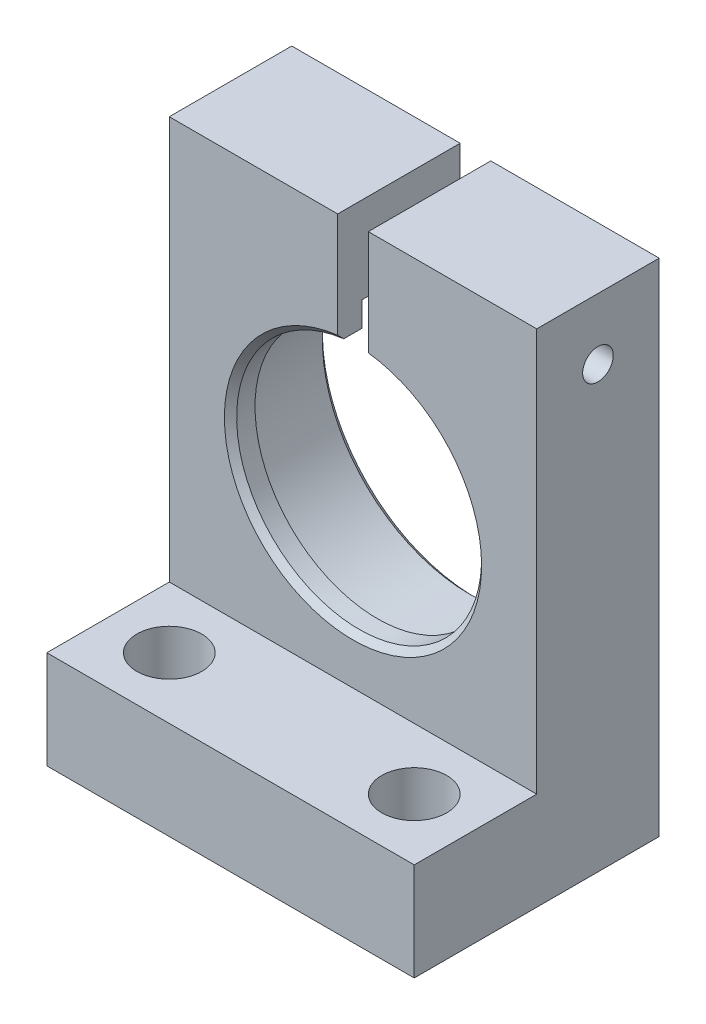
ISO-10303-21;
HEADER;
FILE_DESCRIPTION(('STEP AP214'),'2;1');
FILE_NAME('part.step','',(''),(''),'','','');
FILE_SCHEMA(('AUTOMOTIVE_DESIGN { 1 0 10303 214 1 1 1 1 }'));
ENDSEC;
DATA;
#1=APPLICATION_CONTEXT('core data for automotive mechanical design processes');
#2=APPLICATION_PROTOCOL_DEFINITION('international standard','automotive_design',2000,#1);
#3=PRODUCT_CONTEXT('',#1,'mechanical');
#4=PRODUCT('Part','Part','',(#3));
#5=PRODUCT_RELATED_PRODUCT_CATEGORY('part','',(#4));
#6=PRODUCT_DEFINITION_FORMATION('','',#4);
#7=PRODUCT_DEFINITION_CONTEXT('part definition',#1,'design');
#8=PRODUCT_DEFINITION('design','',#6,#7);
#9=PRODUCT_DEFINITION_SHAPE('','',#8);
#10=(LENGTH_UNIT() NAMED_UNIT(*) SI_UNIT(.MILLI.,.METRE.));
#11=(NAMED_UNIT(*) PLANE_ANGLE_UNIT() SI_UNIT($,.RADIAN.));
#12=(NAMED_UNIT(*) SI_UNIT($,.STERADIAN.) SOLID_ANGLE_UNIT());
#13=UNCERTAINTY_MEASURE_WITH_UNIT(LENGTH_MEASURE(1.E-05),#10,'distance_accuracy_value','');
#14=(GEOMETRIC_REPRESENTATION_CONTEXT(3) GLOBAL_UNCERTAINTY_ASSIGNED_CONTEXT((#13)) GLOBAL_UNIT_ASSIGNED_CONTEXT((#10,
#11,#12)) REPRESENTATION_CONTEXT('',''));
#15=CARTESIAN_POINT('',(0.,0.,0.));
#16=DIRECTION('',(0.,0.,1.));
#17=DIRECTION('',(1.,0.,0.));
#18=AXIS2_PLACEMENT_3D('',#15,#16,#17);
#19=CARTESIAN_POINT('',(0.,0.,10.));
#20=DIRECTION('',(0.,0.,1.));
#21=DIRECTION('',(-1.,0.,0.));
#22=AXIS2_PLACEMENT_3D('',#19,#20,#21);
#23=PLANE('',#22);
#24=DIRECTION('',(0.,-1.,0.));
#25=VECTOR('',#24,1.);
#26=CARTESIAN_POINT('',(15.,-21.9,10.));
#27=LINE('',#26,#25);
#28=CARTESIAN_POINT('',(15.,19.,10.));
#29=VERTEX_POINT('',#28);
#30=CARTESIAN_POINT('',(15.,-13.9,10.));
#31=VERTEX_POINT('',#30);
#32=EDGE_CURVE('E161',#29,#31,#27,.T.);
#33=ORIENTED_EDGE('',*,*,#32,.F.);
#34=DIRECTION('',(1.,0.,0.));
#35=VECTOR('',#34,1.);
#36=CARTESIAN_POINT('',(-15.,19.,10.));
#37=LINE('',#36,#35);
#38=CARTESIAN_POINT('',(1.25,19.,10.));
#39=VERTEX_POINT('',#38);
#40=EDGE_CURVE('E175',#39,#29,#37,.T.);
#41=ORIENTED_EDGE('',*,*,#40,.F.);
#42=DIRECTION('',(0.,-1.,0.));
#43=VECTOR('',#42,1.);
#44=CARTESIAN_POINT('',(1.25,9.92156741649221,10.));
#45=LINE('',#44,#43);
#46=CARTESIAN_POINT('',(1.25,10.4253297309965,10.));
#47=VERTEX_POINT('',#46);
#48=EDGE_CURVE('E348',#39,#47,#45,.T.);
#49=ORIENTED_EDGE('',*,*,#48,.T.);
#50=CARTESIAN_POINT('',(0.,0.,10.));
#51=DIRECTION('',(0.,0.,-1.));
#52=DIRECTION('',(-1.,0.,0.));
#53=AXIS2_PLACEMENT_3D('',#50,#51,#52);
#54=CIRCLE('',#53,10.5);
#55=CARTESIAN_POINT('',(-1.25,10.4253297309965,10.));
#56=VERTEX_POINT('',#55);
#57=EDGE_CURVE('E51',#56,#47,#54,.F.);
#58=ORIENTED_EDGE('',*,*,#57,.F.);
#59=DIRECTION('',(0.,1.,0.));
#60=VECTOR('',#59,1.);
#61=CARTESIAN_POINT('',(-1.25,9.92156741649221,10.));
#62=LINE('',#61,#60);
#63=CARTESIAN_POINT('',(-1.25,19.,10.));
#64=VERTEX_POINT('',#63);
#65=EDGE_CURVE('E343',#56,#64,#62,.T.);
#66=ORIENTED_EDGE('',*,*,#65,.T.);
#67=CARTESIAN_POINT('',(-15.,19.,10.));
#68=VERTEX_POINT('',#67);
#69=EDGE_CURVE('E184',#68,#64,#37,.T.);
#70=ORIENTED_EDGE('',*,*,#69,.F.);
#71=DIRECTION('',(0.,1.,0.));
#72=VECTOR('',#71,1.);
#73=CARTESIAN_POINT('',(-15.,-21.9,10.));
#74=LINE('',#73,#72);
#75=CARTESIAN_POINT('',(-15.,-13.9,10.));
#76=VERTEX_POINT('',#75);
#77=EDGE_CURVE('E163',#76,#68,#74,.T.);
#78=ORIENTED_EDGE('',*,*,#77,.F.);
#79=DIRECTION('',(-1.,0.,0.));
#80=VECTOR('',#79,1.);
#81=CARTESIAN_POINT('',(15.,-13.9,10.));
#82=LINE('',#81,#80);
#83=EDGE_CURVE('E148',#31,#76,#82,.T.);
#84=ORIENTED_EDGE('',*,*,#83,.F.);
#85=EDGE_LOOP('',(#33,#41,#49,#58,#66,#70,#78,#84));
#86=FACE_BOUND('',#85,.T.);
#87=ADVANCED_FACE('F41',(#86),#23,.T.);
#88=CARTESIAN_POINT('',(-15.,19.,10.));
#89=DIRECTION('',(0.,-1.,0.));
#90=DIRECTION('',(-1.,0.,0.));
#91=AXIS2_PLACEMENT_3D('',#88,#89,#90);
#92=PLANE('',#91);
#93=ORIENTED_EDGE('',*,*,#40,.T.);
#94=DIRECTION('',(0.,0.,-1.));
#95=VECTOR('',#94,1.);
#96=CARTESIAN_POINT('',(15.,19.,10.));
#97=LINE('',#96,#95);
#98=CARTESIAN_POINT('',(15.,19.,0.));
#99=VERTEX_POINT('',#98);
#100=EDGE_CURVE('E168',#29,#99,#97,.T.);
#101=ORIENTED_EDGE('',*,*,#100,.T.);
#102=DIRECTION('',(1.,0.,0.));
#103=VECTOR('',#102,1.);
#104=CARTESIAN_POINT('',(-15.,19.,0.));
#105=LINE('',#104,#103);
#106=CARTESIAN_POINT('',(1.25,19.,0.));
#107=VERTEX_POINT('',#106);
#108=EDGE_CURVE('E178',#107,#99,#105,.T.);
#109=ORIENTED_EDGE('',*,*,#108,.F.);
#110=DIRECTION('',(0.,0.,1.));
#111=VECTOR('',#110,1.);
#112=CARTESIAN_POINT('',(1.25,19.,0.));
#113=LINE('',#112,#111);
#114=EDGE_CURVE('E334',#107,#39,#113,.T.);
#115=ORIENTED_EDGE('',*,*,#114,.T.);
#116=EDGE_LOOP('',(#93,#101,#109,#115));
#117=FACE_BOUND('',#116,.T.);
#118=ADVANCED_FACE('F293',(#117),#92,.F.);
#119=CARTESIAN_POINT('',(0.,0.,0.));
#120=DIRECTION('',(0.,0.,1.));
#121=DIRECTION('',(-1.,0.,0.));
#122=AXIS2_PLACEMENT_3D('',#119,#120,#121);
#123=PLANE('',#122);
#124=DIRECTION('',(0.,-1.,0.));
#125=VECTOR('',#124,1.);
#126=CARTESIAN_POINT('',(1.25,9.92156741649221,0.));
#127=LINE('',#126,#125);
#128=CARTESIAN_POINT('',(1.25,12.4373429638328,0.));
#129=VERTEX_POINT('',#128);
#130=EDGE_CURVE('E347',#107,#129,#127,.T.);
#131=ORIENTED_EDGE('',*,*,#130,.F.);
#132=ORIENTED_EDGE('',*,*,#108,.T.);
#133=DIRECTION('',(0.,-1.,0.));
#134=VECTOR('',#133,1.);
#135=CARTESIAN_POINT('',(15.,-21.9,0.));
#136=LINE('',#135,#134);
#137=CARTESIAN_POINT('',(15.,-21.9,0.));
#138=VERTEX_POINT('',#137);
#139=EDGE_CURVE('E188',#99,#138,#136,.T.);
#140=ORIENTED_EDGE('',*,*,#139,.T.);
#141=DIRECTION('',(-1.,0.,0.));
#142=VECTOR('',#141,1.);
#143=CARTESIAN_POINT('',(-15.,-21.9,0.));
#144=LINE('',#143,#142);
#145=CARTESIAN_POINT('',(-15.,-21.9,0.));
#146=VERTEX_POINT('',#145);
#147=EDGE_CURVE('E192',#138,#146,#144,.T.);
#148=ORIENTED_EDGE('',*,*,#147,.T.);
#149=DIRECTION('',(0.,1.,0.));
#150=VECTOR('',#149,1.);
#151=CARTESIAN_POINT('',(-15.,-21.9,0.));
#152=LINE('',#151,#150);
#153=CARTESIAN_POINT('',(-15.,19.,0.));
#154=VERTEX_POINT('',#153);
#155=EDGE_CURVE('E196',#146,#154,#152,.T.);
#156=ORIENTED_EDGE('',*,*,#155,.T.);
#157=CARTESIAN_POINT('',(-1.25,19.,0.));
#158=VERTEX_POINT('',#157);
#159=EDGE_CURVE('E171',#154,#158,#105,.T.);
#160=ORIENTED_EDGE('',*,*,#159,.T.);
#161=DIRECTION('',(0.,1.,0.));
#162=VECTOR('',#161,1.);
#163=CARTESIAN_POINT('',(-1.25,9.92156741649221,0.));
#164=LINE('',#163,#162);
#165=CARTESIAN_POINT('',(-1.25,12.4373429638328,0.));
#166=VERTEX_POINT('',#165);
#167=EDGE_CURVE('E340',#166,#158,#164,.T.);
#168=ORIENTED_EDGE('',*,*,#167,.F.);
#169=CARTESIAN_POINT('',(0.,0.,0.));
#170=DIRECTION('',(0.,0.,-1.));
#171=DIRECTION('',(-1.,0.,0.));
#172=AXIS2_PLACEMENT_3D('',#169,#170,#171);
#173=CIRCLE('',#172,12.5);
#174=EDGE_CURVE('E222',#129,#166,#173,.T.);
#175=ORIENTED_EDGE('',*,*,#174,.F.);
#176=EDGE_LOOP('',(#131,#132,#140,#148,#156,#160,#168,#175));
#177=FACE_BOUND('',#176,.T.);
#178=ADVANCED_FACE('F279',(#177),#123,.F.);
#179=CARTESIAN_POINT('',(15.,-21.9,10.));
#180=DIRECTION('',(-1.,0.,0.));
#181=DIRECTION('',(0.,0.,-1.));
#182=AXIS2_PLACEMENT_3D('',#179,#180,#181);
#183=PLANE('',#182);
#184=CARTESIAN_POINT('',(15.,14.,5.));
#185=DIRECTION('',(-1.,0.,0.));
#186=DIRECTION('',(0.,0.,1.));
#187=AXIS2_PLACEMENT_3D('',#184,#185,#186);
#188=CIRCLE('',#187,1.25);
#189=CARTESIAN_POINT('',(15.,14.,6.25));
#190=VERTEX_POINT('',#189);
#191=EDGE_CURVE('E377',#190,#190,#188,.T.);
#192=ORIENTED_EDGE('',*,*,#191,.T.);
#193=EDGE_LOOP('',(#192));
#194=FACE_BOUND('',#193,.T.);
#195=ORIENTED_EDGE('',*,*,#139,.F.);
#196=ORIENTED_EDGE('',*,*,#100,.F.);
#197=ORIENTED_EDGE('',*,*,#32,.T.);
#198=DIRECTION('',(0.,0.,-1.));
#199=VECTOR('',#198,1.);
#200=CARTESIAN_POINT('',(15.,-13.9,10.));
#201=LINE('',#200,#199);
#202=CARTESIAN_POINT('',(15.,-13.9,20.));
#203=VERTEX_POINT('',#202);
#204=EDGE_CURVE('E145',#203,#31,#201,.T.);
#205=ORIENTED_EDGE('',*,*,#204,.F.);
#206=DIRECTION('',(0.,-1.,0.));
#207=VECTOR('',#206,1.);
#208=CARTESIAN_POINT('',(15.,-13.9,20.));
#209=LINE('',#208,#207);
#210=CARTESIAN_POINT('',(15.,-21.9,20.));
#211=VERTEX_POINT('',#210);
#212=EDGE_CURVE('E381',#203,#211,#209,.T.);
#213=ORIENTED_EDGE('',*,*,#212,.T.);
#214=DIRECTION('',(0.,0.,-1.));
#215=VECTOR('',#214,1.);
#216=CARTESIAN_POINT('',(15.,-21.9,10.));
#217=LINE('',#216,#215);
#218=EDGE_CURVE('E208',#211,#138,#217,.T.);
#219=ORIENTED_EDGE('',*,*,#218,.T.);
#220=EDGE_LOOP('',(#195,#196,#197,#205,#213,#219));
#221=FACE_BOUND('',#220,.T.);
#222=ADVANCED_FACE('F166',(#194,#221),#183,.F.);
#223=CARTESIAN_POINT('',(-15.,-21.9,10.));
#224=DIRECTION('',(0.,1.,0.));
#225=DIRECTION('',(1.,0.,0.));
#226=AXIS2_PLACEMENT_3D('',#223,#224,#225);
#227=PLANE('',#226);
#228=CARTESIAN_POINT('',(10.,-21.9,15.));
#229=DIRECTION('',(0.,-1.,0.));
#230=DIRECTION('',(1.,0.,0.));
#231=AXIS2_PLACEMENT_3D('',#228,#229,#230);
#232=CIRCLE('',#231,2.65);
#233=CARTESIAN_POINT('',(12.65,-21.9,15.));
#234=VERTEX_POINT('',#233);
#235=EDGE_CURVE('E401',#234,#234,#232,.T.);
#236=ORIENTED_EDGE('',*,*,#235,.F.);
#237=EDGE_LOOP('',(#236));
#238=FACE_BOUND('',#237,.T.);
#239=CARTESIAN_POINT('',(-10.,-21.9,15.));
#240=DIRECTION('',(0.,-1.,0.));
#241=DIRECTION('',(1.,0.,0.));
#242=AXIS2_PLACEMENT_3D('',#239,#240,#241);
#243=CIRCLE('',#242,2.65);
#244=CARTESIAN_POINT('',(-7.35,-21.9,15.));
#245=VERTEX_POINT('',#244);
#246=EDGE_CURVE('E389',#245,#245,#243,.T.);
#247=ORIENTED_EDGE('',*,*,#246,.F.);
#248=EDGE_LOOP('',(#247));
#249=FACE_BOUND('',#248,.T.);
#250=ORIENTED_EDGE('',*,*,#147,.F.);
#251=ORIENTED_EDGE('',*,*,#218,.F.);
#252=DIRECTION('',(1.,0.,0.));
#253=VECTOR('',#252,1.);
#254=CARTESIAN_POINT('',(15.,-21.9,20.));
#255=LINE('',#254,#253);
#256=CARTESIAN_POINT('',(-15.,-21.9,20.));
#257=VERTEX_POINT('',#256);
#258=EDGE_CURVE('E156',#257,#211,#255,.T.);
#259=ORIENTED_EDGE('',*,*,#258,.F.);
#260=DIRECTION('',(0.,0.,-1.));
#261=VECTOR('',#260,1.);
#262=CARTESIAN_POINT('',(-15.,-21.9,10.));
#263=LINE('',#262,#261);
#264=EDGE_CURVE('E205',#257,#146,#263,.T.);
#265=ORIENTED_EDGE('',*,*,#264,.T.);
#266=EDGE_LOOP('',(#250,#251,#259,#265));
#267=FACE_BOUND('',#266,.T.);
#268=ADVANCED_FACE('F278',(#238,#249,#267),#227,.F.);
#269=CARTESIAN_POINT('',(-15.,-21.9,10.));
#270=DIRECTION('',(1.,0.,0.));
#271=DIRECTION('',(0.,0.,1.));
#272=AXIS2_PLACEMENT_3D('',#269,#270,#271);
#273=PLANE('',#272);
#274=CARTESIAN_POINT('',(-15.,14.,5.));
#275=DIRECTION('',(1.,0.,0.));
#276=DIRECTION('',(0.,0.,-1.));
#277=AXIS2_PLACEMENT_3D('',#274,#275,#276);
#278=CIRCLE('',#277,3.25);
#279=CARTESIAN_POINT('',(-15.,14.,1.75));
#280=VERTEX_POINT('',#279);
#281=EDGE_CURVE('E369',#280,#280,#278,.T.);
#282=ORIENTED_EDGE('',*,*,#281,.T.);
#283=EDGE_LOOP('',(#282));
#284=FACE_BOUND('',#283,.T.);
#285=ORIENTED_EDGE('',*,*,#155,.F.);
#286=ORIENTED_EDGE('',*,*,#264,.F.);
#287=DIRECTION('',(0.,-1.,0.));
#288=VECTOR('',#287,1.);
#289=CARTESIAN_POINT('',(-15.,-13.9,20.));
#290=LINE('',#289,#288);
#291=CARTESIAN_POINT('',(-15.,-13.9,20.));
#292=VERTEX_POINT('',#291);
#293=EDGE_CURVE('E382',#292,#257,#290,.T.);
#294=ORIENTED_EDGE('',*,*,#293,.F.);
#295=DIRECTION('',(0.,0.,1.));
#296=VECTOR('',#295,1.);
#297=CARTESIAN_POINT('',(-15.,-13.9,10.));
#298=LINE('',#297,#296);
#299=EDGE_CURVE('E58',#76,#292,#298,.T.);
#300=ORIENTED_EDGE('',*,*,#299,.F.);
#301=ORIENTED_EDGE('',*,*,#77,.T.);
#302=DIRECTION('',(0.,0.,-1.));
#303=VECTOR('',#302,1.);
#304=CARTESIAN_POINT('',(-15.,19.,10.));
#305=LINE('',#304,#303);
#306=EDGE_CURVE('E202',#68,#154,#305,.T.);
#307=ORIENTED_EDGE('',*,*,#306,.T.);
#308=EDGE_LOOP('',(#285,#286,#294,#300,#301,#307));
#309=FACE_BOUND('',#308,.T.);
#310=ADVANCED_FACE('F283',(#284,#309),#273,.F.);
#311=ORIENTED_EDGE('',*,*,#159,.F.);
#312=ORIENTED_EDGE('',*,*,#306,.F.);
#313=ORIENTED_EDGE('',*,*,#69,.T.);
#314=DIRECTION('',(0.,0.,1.));
#315=VECTOR('',#314,1.);
#316=CARTESIAN_POINT('',(-1.25,19.,0.));
#317=LINE('',#316,#315);
#318=EDGE_CURVE('E337',#158,#64,#317,.T.);
#319=ORIENTED_EDGE('',*,*,#318,.F.);
#320=EDGE_LOOP('',(#311,#312,#313,#319));
#321=FACE_BOUND('',#320,.T.);
#322=ADVANCED_FACE('F287',(#321),#92,.F.);
#323=CARTESIAN_POINT('',(0.,0.,10.));
#324=DIRECTION('',(0.,0.,-1.));
#325=DIRECTION('',(1.,0.,0.));
#326=AXIS2_PLACEMENT_3D('',#323,#324,#325);
#327=CYLINDRICAL_SURFACE('',#326,12.);
#328=DIRECTION('',(0.,0.,-1.));
#329=VECTOR('',#328,1.);
#330=CARTESIAN_POINT('',(-1.25,11.93471826228,10.));
#331=LINE('',#330,#329);
#332=CARTESIAN_POINT('',(-1.25,11.93471826228,0.500000000000002));
#333=VERTEX_POINT('',#332);
#334=CARTESIAN_POINT('',(-1.25,11.93471826228,8.));
#335=VERTEX_POINT('',#334);
#336=EDGE_CURVE('E320',#333,#335,#331,.F.);
#337=ORIENTED_EDGE('',*,*,#336,.T.);
#338=CARTESIAN_POINT('',(0.,0.,8.));
#339=DIRECTION('',(0.,0.,1.));
#340=DIRECTION('',(1.,0.,0.));
#341=AXIS2_PLACEMENT_3D('',#338,#339,#340);
#342=CIRCLE('',#341,12.);
#343=CARTESIAN_POINT('',(1.25,11.93471826228,8.));
#344=VERTEX_POINT('',#343);
#345=EDGE_CURVE('E211',#335,#344,#342,.T.);
#346=ORIENTED_EDGE('',*,*,#345,.T.);
#347=DIRECTION('',(0.,0.,-1.));
#348=VECTOR('',#347,1.);
#349=CARTESIAN_POINT('',(1.25,11.93471826228,10.));
#350=LINE('',#349,#348);
#351=CARTESIAN_POINT('',(1.25,11.93471826228,0.500000000000002));
#352=VERTEX_POINT('',#351);
#353=EDGE_CURVE('E319',#344,#352,#350,.T.);
#354=ORIENTED_EDGE('',*,*,#353,.T.);
#355=CARTESIAN_POINT('',(0.,0.,0.500000000000002));
#356=DIRECTION('',(0.,0.,-1.));
#357=DIRECTION('',(-1.,0.,0.));
#358=AXIS2_PLACEMENT_3D('',#355,#356,#357);
#359=CIRCLE('',#358,12.);
#360=EDGE_CURVE('E328',#333,#352,#359,.F.);
#361=ORIENTED_EDGE('',*,*,#360,.F.);
#362=EDGE_LOOP('',(#337,#346,#354,#361));
#363=FACE_BOUND('',#362,.T.);
#364=ADVANCED_FACE('F291',(#363),#327,.F.);
#365=CARTESIAN_POINT('',(0.,0.,8.));
#366=DIRECTION('',(0.,0.,-1.));
#367=DIRECTION('',(1.,0.,0.));
#368=AXIS2_PLACEMENT_3D('',#365,#366,#367);
#369=PLANE('',#368);
#370=DIRECTION('',(0.,1.,0.));
#371=VECTOR('',#370,1.);
#372=CARTESIAN_POINT('',(1.25,0.,8.));
#373=LINE('',#372,#371);
#374=CARTESIAN_POINT('',(1.25,9.92156741649221,8.));
#375=VERTEX_POINT('',#374);
#376=EDGE_CURVE('E311',#375,#344,#373,.T.);
#377=ORIENTED_EDGE('',*,*,#376,.T.);
#378=ORIENTED_EDGE('',*,*,#345,.F.);
#379=DIRECTION('',(0.,-1.,0.));
#380=VECTOR('',#379,1.);
#381=CARTESIAN_POINT('',(-1.25,0.,8.));
#382=LINE('',#381,#380);
#383=CARTESIAN_POINT('',(-1.25,9.92156741649221,8.));
#384=VERTEX_POINT('',#383);
#385=EDGE_CURVE('E331',#335,#384,#382,.T.);
#386=ORIENTED_EDGE('',*,*,#385,.T.);
#387=CARTESIAN_POINT('',(0.,0.,8.));
#388=DIRECTION('',(0.,0.,1.));
#389=DIRECTION('',(1.,0.,0.));
#390=AXIS2_PLACEMENT_3D('',#387,#388,#389);
#391=CIRCLE('',#390,10.);
#392=EDGE_CURVE('E181',#384,#375,#391,.T.);
#393=ORIENTED_EDGE('',*,*,#392,.T.);
#394=EDGE_LOOP('',(#377,#378,#386,#393));
#395=FACE_BOUND('',#394,.T.);
#396=ADVANCED_FACE('F300',(#395),#369,.T.);
#397=CARTESIAN_POINT('',(0.,0.,8.));
#398=DIRECTION('',(0.,0.,1.));
#399=DIRECTION('',(-1.,0.,0.));
#400=AXIS2_PLACEMENT_3D('',#397,#398,#399);
#401=CYLINDRICAL_SURFACE('',#400,10.);
#402=DIRECTION('',(0.,0.,1.));
#403=VECTOR('',#402,1.);
#404=CARTESIAN_POINT('',(1.25,9.92156741649221,8.));
#405=LINE('',#404,#403);
#406=CARTESIAN_POINT('',(1.25,9.92156741649221,9.50000000000001));
#407=VERTEX_POINT('',#406);
#408=EDGE_CURVE('E215',#407,#375,#405,.F.);
#409=ORIENTED_EDGE('',*,*,#408,.T.);
#410=ORIENTED_EDGE('',*,*,#392,.F.);
#411=DIRECTION('',(0.,0.,1.));
#412=VECTOR('',#411,1.);
#413=CARTESIAN_POINT('',(-1.25,9.92156741649221,8.));
#414=LINE('',#413,#412);
#415=CARTESIAN_POINT('',(-1.25,9.92156741649221,9.50000000000001));
#416=VERTEX_POINT('',#415);
#417=EDGE_CURVE('E218',#384,#416,#414,.T.);
#418=ORIENTED_EDGE('',*,*,#417,.T.);
#419=CARTESIAN_POINT('',(0.,0.,9.50000000000001));
#420=DIRECTION('',(0.,0.,-1.));
#421=DIRECTION('',(-1.,0.,0.));
#422=AXIS2_PLACEMENT_3D('',#419,#420,#421);
#423=CIRCLE('',#422,10.);
#424=EDGE_CURVE('E11',#407,#416,#423,.T.);
#425=ORIENTED_EDGE('',*,*,#424,.F.);
#426=EDGE_LOOP('',(#409,#410,#418,#425));
#427=FACE_BOUND('',#426,.T.);
#428=ADVANCED_FACE('F253',(#427),#401,.F.);
#429=CARTESIAN_POINT('',(1.25,9.92156741649221,0.));
#430=DIRECTION('',(1.,0.,0.));
#431=DIRECTION('',(0.,-1.,0.));
#432=AXIS2_PLACEMENT_3D('',#429,#430,#431);
#433=PLANE('',#432);
#434=CARTESIAN_POINT('',(1.25,14.,5.));
#435=DIRECTION('',(-1.,0.,0.));
#436=DIRECTION('',(0.,-1.,0.));
#437=AXIS2_PLACEMENT_3D('',#434,#435,#436);
#438=CIRCLE('',#437,1.25);
#439=CARTESIAN_POINT('',(1.25,12.75,5.));
#440=VERTEX_POINT('',#439);
#441=EDGE_CURVE('E373',#440,#440,#438,.T.);
#442=ORIENTED_EDGE('',*,*,#441,.F.);
#443=EDGE_LOOP('',(#442));
#444=FACE_BOUND('',#443,.T.);
#445=ORIENTED_EDGE('',*,*,#353,.F.);
#446=ORIENTED_EDGE('',*,*,#376,.F.);
#447=ORIENTED_EDGE('',*,*,#408,.F.);
#448=CARTESIAN_POINT('',(1.25,10.4253297309965,10.));
#449=CARTESIAN_POINT('',(1.25,10.3413846963342,9.91665120010179));
#450=CARTESIAN_POINT('',(1.25,10.2574319861363,9.83331013349464));
#451=CARTESIAN_POINT('',(1.25,10.0895112146349,9.66664346682797));
#452=CARTESIAN_POINT('',(1.25,10.0055431533313,9.58331786676846));
#453=CARTESIAN_POINT('',(1.25,9.92156741649221,9.50000000000001));
#454=B_SPLINE_CURVE_WITH_KNOTS('',3,(#448,#449,#450,#451,#452,#453),.UNSPECIFIED.,.F.,.F.,(4,2,
4),(0.,0.354886063962817,0.709772128072496),.UNSPECIFIED.);
#455=EDGE_CURVE('E65',#47,#407,#454,.T.);
#456=ORIENTED_EDGE('',*,*,#455,.F.);
#457=ORIENTED_EDGE('',*,*,#48,.F.);
#458=ORIENTED_EDGE('',*,*,#114,.F.);
#459=ORIENTED_EDGE('',*,*,#130,.T.);
#460=CARTESIAN_POINT('',(1.25,11.93471826228,0.500000000000002));
#461=CARTESIAN_POINT('',(1.25,12.0184979967429,0.416675664514309));
#462=CARTESIAN_POINT('',(1.25,12.1022732557729,0.333346830102343));
#463=CARTESIAN_POINT('',(1.25,12.2698148229571,0.166680163435674));
#464=CARTESIAN_POINT('',(1.25,12.3535811311114,0.083342331180973));
#465=CARTESIAN_POINT('',(1.25,12.4373429638328,0.));
#466=B_SPLINE_CURVE_WITH_KNOTS('',3,(#460,#461,#462,#463,#464,#465),.UNSPECIFIED.,.F.,.F.,(4,2,
4),(0.,0.354482577893423,0.708965155745116),.UNSPECIFIED.);
#467=EDGE_CURVE('E263',#352,#129,#466,.T.);
#468=ORIENTED_EDGE('',*,*,#467,.F.);
#469=EDGE_LOOP('',(#445,#446,#447,#456,#457,#458,#459,#468));
#470=FACE_BOUND('',#469,.T.);
#471=ADVANCED_FACE('F246',(#444,#470),#433,.F.);
#472=CARTESIAN_POINT('',(-1.25,9.92156741649221,0.));
#473=DIRECTION('',(-1.,0.,0.));
#474=DIRECTION('',(0.,1.,0.));
#475=AXIS2_PLACEMENT_3D('',#472,#473,#474);
#476=PLANE('',#475);
#477=CARTESIAN_POINT('',(-1.25,14.,5.));
#478=DIRECTION('',(1.,0.,0.));
#479=DIRECTION('',(0.,1.,0.));
#480=AXIS2_PLACEMENT_3D('',#477,#478,#479);
#481=CIRCLE('',#480,1.6);
#482=CARTESIAN_POINT('',(-1.25,15.6,5.));
#483=VERTEX_POINT('',#482);
#484=EDGE_CURVE('E352',#483,#483,#481,.T.);
#485=ORIENTED_EDGE('',*,*,#484,.F.);
#486=EDGE_LOOP('',(#485));
#487=FACE_BOUND('',#486,.T.);
#488=ORIENTED_EDGE('',*,*,#167,.T.);
#489=ORIENTED_EDGE('',*,*,#318,.T.);
#490=ORIENTED_EDGE('',*,*,#65,.F.);
#491=CARTESIAN_POINT('',(-1.25,9.92156741649221,9.50000000000001));
#492=CARTESIAN_POINT('',(-1.25,10.0055431533313,9.58331786676846));
#493=CARTESIAN_POINT('',(-1.25,10.0895112146349,9.66664346682797));
#494=CARTESIAN_POINT('',(-1.25,10.2574319861363,9.83331013349464));
#495=CARTESIAN_POINT('',(-1.25,10.3413846963342,9.91665120010179));
#496=CARTESIAN_POINT('',(-1.25,10.4253297309965,10.));
#497=B_SPLINE_CURVE_WITH_KNOTS('',3,(#491,#492,#493,#494,#495,#496),.UNSPECIFIED.,.F.,.F.,(4,2,
4),(0.,0.35488606410968,0.709772128072496),.UNSPECIFIED.);
#498=EDGE_CURVE('E226',#416,#56,#497,.T.);
#499=ORIENTED_EDGE('',*,*,#498,.F.);
#500=ORIENTED_EDGE('',*,*,#417,.F.);
#501=ORIENTED_EDGE('',*,*,#385,.F.);
#502=ORIENTED_EDGE('',*,*,#336,.F.);
#503=CARTESIAN_POINT('',(-1.25,12.4373429638328,0.));
#504=CARTESIAN_POINT('',(-1.25,12.3535811311114,0.0833423311809731));
#505=CARTESIAN_POINT('',(-1.25,12.2698148229571,0.166680163435674));
#506=CARTESIAN_POINT('',(-1.25,12.1022732557729,0.333346830102342));
#507=CARTESIAN_POINT('',(-1.25,12.0184979967429,0.416675664514308));
#508=CARTESIAN_POINT('',(-1.25,11.93471826228,0.500000000000001));
#509=B_SPLINE_CURVE_WITH_KNOTS('',3,(#503,#504,#505,#506,#507,#508),.UNSPECIFIED.,.F.,.F.,(4,2,
4),(0.,0.354482577851693,0.708965155745116),.UNSPECIFIED.);
#510=EDGE_CURVE('E234',#166,#333,#509,.T.);
#511=ORIENTED_EDGE('',*,*,#510,.F.);
#512=EDGE_LOOP('',(#488,#489,#490,#499,#500,#501,#502,#511));
#513=FACE_BOUND('',#512,.T.);
#514=ADVANCED_FACE('F240',(#487,#513),#476,.F.);
#515=CARTESIAN_POINT('',(-15.,14.,5.));
#516=DIRECTION('',(-1.,0.,0.));
#517=DIRECTION('',(0.,0.,-1.));
#518=AXIS2_PLACEMENT_3D('',#515,#516,#517);
#519=CYLINDRICAL_SURFACE('',#518,1.6);
#520=ORIENTED_EDGE('',*,*,#484,.T.);
#521=EDGE_LOOP('',(#520));
#522=FACE_BOUND('',#521,.T.);
#523=CARTESIAN_POINT('',(-12.,14.,5.));
#524=DIRECTION('',(1.,0.,0.));
#525=DIRECTION('',(0.,0.,-1.));
#526=AXIS2_PLACEMENT_3D('',#523,#524,#525);
#527=CIRCLE('',#526,1.6);
#528=CARTESIAN_POINT('',(-12.,14.,3.4));
#529=VERTEX_POINT('',#528);
#530=EDGE_CURVE('E361',#529,#529,#527,.T.);
#531=ORIENTED_EDGE('',*,*,#530,.F.);
#532=EDGE_LOOP('',(#531));
#533=FACE_BOUND('',#532,.T.);
#534=ADVANCED_FACE('F245',(#522,#533),#519,.F.);
#535=CARTESIAN_POINT('',(-12.,15.6,5.));
#536=DIRECTION('',(1.,0.,0.));
#537=DIRECTION('',(0.,0.,1.));
#538=AXIS2_PLACEMENT_3D('',#535,#536,#537);
#539=PLANE('',#538);
#540=ORIENTED_EDGE('',*,*,#530,.T.);
#541=EDGE_LOOP('',(#540));
#542=FACE_BOUND('',#541,.T.);
#543=CARTESIAN_POINT('',(-12.,14.,5.));
#544=DIRECTION('',(1.,0.,0.));
#545=DIRECTION('',(0.,0.,-1.));
#546=AXIS2_PLACEMENT_3D('',#543,#544,#545);
#547=CIRCLE('',#546,3.25);
#548=CARTESIAN_POINT('',(-12.,14.,1.75));
#549=VERTEX_POINT('',#548);
#550=EDGE_CURVE('E365',#549,#549,#547,.T.);
#551=ORIENTED_EDGE('',*,*,#550,.F.);
#552=EDGE_LOOP('',(#551));
#553=FACE_BOUND('',#552,.T.);
#554=ADVANCED_FACE('F434',(#542,#553),#539,.F.);
#555=CARTESIAN_POINT('',(-15.,14.,5.));
#556=DIRECTION('',(-1.,0.,0.));
#557=DIRECTION('',(0.,0.,-1.));
#558=AXIS2_PLACEMENT_3D('',#555,#556,#557);
#559=CYLINDRICAL_SURFACE('',#558,3.25);
#560=ORIENTED_EDGE('',*,*,#550,.T.);
#561=EDGE_LOOP('',(#560));
#562=FACE_BOUND('',#561,.T.);
#563=ORIENTED_EDGE('',*,*,#281,.F.);
#564=EDGE_LOOP('',(#563));
#565=FACE_BOUND('',#564,.T.);
#566=ADVANCED_FACE('F431',(#562,#565),#559,.F.);
#567=CARTESIAN_POINT('',(15.,14.,5.));
#568=DIRECTION('',(1.,0.,0.));
#569=DIRECTION('',(0.,0.,1.));
#570=AXIS2_PLACEMENT_3D('',#567,#568,#569);
#571=CYLINDRICAL_SURFACE('',#570,1.25);
#572=ORIENTED_EDGE('',*,*,#441,.T.);
#573=EDGE_LOOP('',(#572));
#574=FACE_BOUND('',#573,.T.);
#575=ORIENTED_EDGE('',*,*,#191,.F.);
#576=EDGE_LOOP('',(#575));
#577=FACE_BOUND('',#576,.T.);
#578=ADVANCED_FACE('F273',(#574,#577),#571,.F.);
#579=CARTESIAN_POINT('',(0.,0.,0.));
#580=DIRECTION('',(0.,0.,-1.));
#581=DIRECTION('',(1.,0.,0.));
#582=AXIS2_PLACEMENT_3D('',#579,#580,#581);
#583=CONICAL_SURFACE('',#582,12.5,0.785398163397448);
#584=ORIENTED_EDGE('',*,*,#467,.T.);
#585=ORIENTED_EDGE('',*,*,#174,.T.);
#586=ORIENTED_EDGE('',*,*,#510,.T.);
#587=ORIENTED_EDGE('',*,*,#360,.T.);
#588=EDGE_LOOP('',(#584,#585,#586,#587));
#589=FACE_BOUND('',#588,.T.);
#590=ADVANCED_FACE('F269',(#589),#583,.F.);
#591=CARTESIAN_POINT('',(0.,0.,10.));
#592=DIRECTION('',(0.,0.,1.));
#593=DIRECTION('',(-1.,0.,0.));
#594=AXIS2_PLACEMENT_3D('',#591,#592,#593);
#595=CONICAL_SURFACE('',#594,10.5,0.785398163397448);
#596=ORIENTED_EDGE('',*,*,#498,.T.);
#597=ORIENTED_EDGE('',*,*,#57,.T.);
#598=ORIENTED_EDGE('',*,*,#455,.T.);
#599=ORIENTED_EDGE('',*,*,#424,.T.);
#600=EDGE_LOOP('',(#596,#597,#598,#599));
#601=FACE_BOUND('',#600,.T.);
#602=ADVANCED_FACE('F43',(#601),#595,.F.);
#603=CARTESIAN_POINT('',(15.,-13.9,20.));
#604=DIRECTION('',(0.,0.,1.));
#605=DIRECTION('',(-1.,0.,0.));
#606=AXIS2_PLACEMENT_3D('',#603,#604,#605);
#607=PLANE('',#606);
#608=ORIENTED_EDGE('',*,*,#258,.T.);
#609=ORIENTED_EDGE('',*,*,#212,.F.);
#610=DIRECTION('',(1.,0.,0.));
#611=VECTOR('',#610,1.);
#612=CARTESIAN_POINT('',(15.,-13.9,20.));
#613=LINE('',#612,#611);
#614=EDGE_CURVE('E150',#292,#203,#613,.T.);
#615=ORIENTED_EDGE('',*,*,#614,.F.);
#616=ORIENTED_EDGE('',*,*,#293,.T.);
#617=EDGE_LOOP('',(#608,#609,#615,#616));
#618=FACE_BOUND('',#617,.T.);
#619=ADVANCED_FACE('F425',(#618),#607,.T.);
#620=CARTESIAN_POINT('',(0.,-13.9,0.));
#621=DIRECTION('',(0.,1.,0.));
#622=DIRECTION('',(1.,0.,0.));
#623=AXIS2_PLACEMENT_3D('',#620,#621,#622);
#624=PLANE('',#623);
#625=CARTESIAN_POINT('',(10.,-13.9,15.));
#626=DIRECTION('',(0.,-1.,0.));
#627=DIRECTION('',(0.,0.,1.));
#628=AXIS2_PLACEMENT_3D('',#625,#626,#627);
#629=CIRCLE('',#628,2.65);
#630=CARTESIAN_POINT('',(10.,-13.9,17.65));
#631=VERTEX_POINT('',#630);
#632=EDGE_CURVE('E405',#631,#631,#629,.T.);
#633=ORIENTED_EDGE('',*,*,#632,.T.);
#634=EDGE_LOOP('',(#633));
#635=FACE_BOUND('',#634,.T.);
#636=CARTESIAN_POINT('',(-10.,-13.9,15.));
#637=DIRECTION('',(0.,-1.,0.));
#638=DIRECTION('',(0.,0.,1.));
#639=AXIS2_PLACEMENT_3D('',#636,#637,#638);
#640=CIRCLE('',#639,2.65);
#641=CARTESIAN_POINT('',(-10.,-13.9,17.65));
#642=VERTEX_POINT('',#641);
#643=EDGE_CURVE('E397',#642,#642,#640,.T.);
#644=ORIENTED_EDGE('',*,*,#643,.T.);
#645=EDGE_LOOP('',(#644));
#646=FACE_BOUND('',#645,.T.);
#647=ORIENTED_EDGE('',*,*,#204,.T.);
#648=ORIENTED_EDGE('',*,*,#83,.T.);
#649=ORIENTED_EDGE('',*,*,#299,.T.);
#650=ORIENTED_EDGE('',*,*,#614,.T.);
#651=EDGE_LOOP('',(#647,#648,#649,#650));
#652=FACE_BOUND('',#651,.T.);
#653=ADVANCED_FACE('F147',(#635,#646,#652),#624,.T.);
#654=CARTESIAN_POINT('',(-10.,-13.9,15.));
#655=DIRECTION('',(0.,1.,0.));
#656=DIRECTION('',(0.,0.,1.));
#657=AXIS2_PLACEMENT_3D('',#654,#655,#656);
#658=CYLINDRICAL_SURFACE('',#657,2.65);
#659=ORIENTED_EDGE('',*,*,#246,.T.);
#660=EDGE_LOOP('',(#659));
#661=FACE_BOUND('',#660,.T.);
#662=ORIENTED_EDGE('',*,*,#643,.F.);
#663=EDGE_LOOP('',(#662));
#664=FACE_BOUND('',#663,.T.);
#665=ADVANCED_FACE('F414',(#661,#664),#658,.F.);
#666=CARTESIAN_POINT('',(10.,-13.9,15.));
#667=DIRECTION('',(0.,1.,0.));
#668=DIRECTION('',(0.,0.,1.));
#669=AXIS2_PLACEMENT_3D('',#666,#667,#668);
#670=CYLINDRICAL_SURFACE('',#669,2.65);
#671=ORIENTED_EDGE('',*,*,#235,.T.);
#672=EDGE_LOOP('',(#671));
#673=FACE_BOUND('',#672,.T.);
#674=ORIENTED_EDGE('',*,*,#632,.F.);
#675=EDGE_LOOP('',(#674));
#676=FACE_BOUND('',#675,.T.);
#677=ADVANCED_FACE('F412',(#673,#676),#670,.F.);
#678=CLOSED_SHELL('',(#87,#118,#178,#222,#268,#310,#322,#364,#396,#428,#471,#514,#534,#554,#566,
#578,#590,#602,#619,#653,#665,#677));
#679=MANIFOLD_SOLID_BREP('B2',#678);
#680=ADVANCED_BREP_SHAPE_REPRESENTATION('',(#18,#679),#14);
#681=SHAPE_DEFINITION_REPRESENTATION(#9,#680);
ENDSEC;
END-ISO-10303-21;
